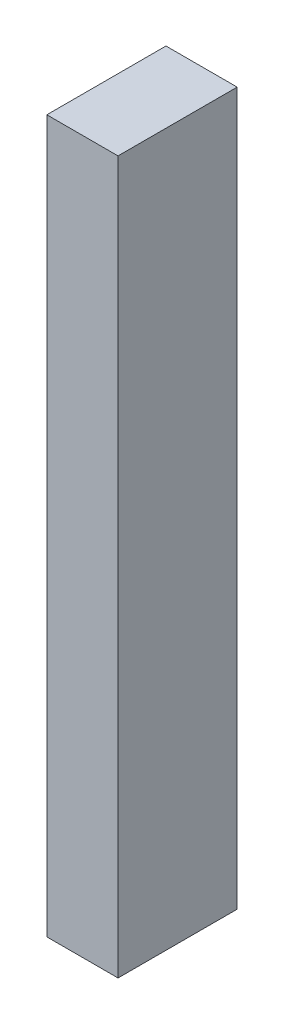
ISO-10303-21;
HEADER;
FILE_DESCRIPTION(('STEP AP214'),'2;1');
FILE_NAME('part.step','',(''),(''),'','','');
FILE_SCHEMA(('AUTOMOTIVE_DESIGN { 1 0 10303 214 1 1 1 1 }'));
ENDSEC;
DATA;
#1=APPLICATION_CONTEXT('core data for automotive mechanical design processes');
#2=APPLICATION_PROTOCOL_DEFINITION('international standard','automotive_design',2000,#1);
#3=PRODUCT_CONTEXT('',#1,'mechanical');
#4=PRODUCT('Part','Part','',(#3));
#5=PRODUCT_RELATED_PRODUCT_CATEGORY('part','',(#4));
#6=PRODUCT_DEFINITION_FORMATION('','',#4);
#7=PRODUCT_DEFINITION_CONTEXT('part definition',#1,'design');
#8=PRODUCT_DEFINITION('design','',#6,#7);
#9=PRODUCT_DEFINITION_SHAPE('','',#8);
#10=(LENGTH_UNIT() NAMED_UNIT(*) SI_UNIT(.MILLI.,.METRE.));
#11=(NAMED_UNIT(*) PLANE_ANGLE_UNIT() SI_UNIT($,.RADIAN.));
#12=(NAMED_UNIT(*) SI_UNIT($,.STERADIAN.) SOLID_ANGLE_UNIT());
#13=UNCERTAINTY_MEASURE_WITH_UNIT(LENGTH_MEASURE(1.E-05),#10,'distance_accuracy_value','');
#14=(GEOMETRIC_REPRESENTATION_CONTEXT(3) GLOBAL_UNCERTAINTY_ASSIGNED_CONTEXT((#13)) GLOBAL_UNIT_ASSIGNED_CONTEXT((#10,
#11,#12)) REPRESENTATION_CONTEXT('',''));
#15=CARTESIAN_POINT('',(0.,0.,0.));
#16=DIRECTION('',(0.,0.,1.));
#17=DIRECTION('',(1.,0.,0.));
#18=AXIS2_PLACEMENT_3D('',#15,#16,#17);
#19=CARTESIAN_POINT('',(2.54,25.4,0.));
#20=DIRECTION('',(1.,0.,0.));
#21=DIRECTION('',(0.,0.,-1.));
#22=AXIS2_PLACEMENT_3D('',#19,#20,#21);
#23=PLANE('',#22);
#24=DIRECTION('',(0.,0.,-1.));
#25=VECTOR('',#24,1.);
#26=CARTESIAN_POINT('',(2.54,-25.4,0.));
#27=LINE('',#26,#25);
#28=CARTESIAN_POINT('',(2.54,-25.4,0.));
#29=VERTEX_POINT('',#28);
#30=CARTESIAN_POINT('',(2.54,-25.4,8.50000078));
#31=VERTEX_POINT('',#30);
#32=EDGE_CURVE('E19',#29,#31,#27,.F.);
#33=ORIENTED_EDGE('',*,*,#32,.F.);
#34=DIRECTION('',(0.,1.,0.));
#35=VECTOR('',#34,1.);
#36=CARTESIAN_POINT('',(2.54,-25.4,0.));
#37=LINE('',#36,#35);
#38=CARTESIAN_POINT('',(2.54,25.4,0.));
#39=VERTEX_POINT('',#38);
#40=EDGE_CURVE('E78',#29,#39,#37,.T.);
#41=ORIENTED_EDGE('',*,*,#40,.T.);
#42=DIRECTION('',(0.,0.,1.));
#43=VECTOR('',#42,1.);
#44=CARTESIAN_POINT('',(2.54,25.4,0.));
#45=LINE('',#44,#43);
#46=CARTESIAN_POINT('',(2.54,25.4,8.50000078));
#47=VERTEX_POINT('',#46);
#48=EDGE_CURVE('E60',#47,#39,#45,.F.);
#49=ORIENTED_EDGE('',*,*,#48,.F.);
#50=DIRECTION('',(0.,1.,0.));
#51=VECTOR('',#50,1.);
#52=CARTESIAN_POINT('',(2.54,-25.4,8.50000078));
#53=LINE('',#52,#51);
#54=EDGE_CURVE('E55',#31,#47,#53,.T.);
#55=ORIENTED_EDGE('',*,*,#54,.F.);
#56=EDGE_LOOP('',(#33,#41,#49,#55));
#57=FACE_BOUND('',#56,.T.);
#58=ADVANCED_FACE('F16',(#57),#23,.T.);
#59=CARTESIAN_POINT('',(2.54,-25.4,0.));
#60=DIRECTION('',(0.,-1.,0.));
#61=DIRECTION('',(0.,0.,-1.));
#62=AXIS2_PLACEMENT_3D('',#59,#60,#61);
#63=PLANE('',#62);
#64=DIRECTION('',(0.,0.,1.));
#65=VECTOR('',#64,1.);
#66=CARTESIAN_POINT('',(-2.54,-25.4,0.));
#67=LINE('',#66,#65);
#68=CARTESIAN_POINT('',(-2.54,-25.4,0.));
#69=VERTEX_POINT('',#68);
#70=CARTESIAN_POINT('',(-2.54,-25.4,8.50000078));
#71=VERTEX_POINT('',#70);
#72=EDGE_CURVE('E82',#69,#71,#67,.T.);
#73=ORIENTED_EDGE('',*,*,#72,.F.);
#74=DIRECTION('',(1.,0.,0.));
#75=VECTOR('',#74,1.);
#76=CARTESIAN_POINT('',(2.54,-25.4,0.));
#77=LINE('',#76,#75);
#78=EDGE_CURVE('E67',#69,#29,#77,.T.);
#79=ORIENTED_EDGE('',*,*,#78,.T.);
#80=ORIENTED_EDGE('',*,*,#32,.T.);
#81=DIRECTION('',(1.,0.,0.));
#82=VECTOR('',#81,1.);
#83=CARTESIAN_POINT('',(2.54,-25.4,8.50000078));
#84=LINE('',#83,#82);
#85=EDGE_CURVE('E62',#71,#31,#84,.T.);
#86=ORIENTED_EDGE('',*,*,#85,.F.);
#87=EDGE_LOOP('',(#73,#79,#80,#86));
#88=FACE_BOUND('',#87,.T.);
#89=ADVANCED_FACE('F64',(#88),#63,.T.);
#90=CARTESIAN_POINT('',(2.54,-25.4,8.50000078));
#91=DIRECTION('',(0.,0.,1.));
#92=DIRECTION('',(1.,0.,0.));
#93=AXIS2_PLACEMENT_3D('',#90,#91,#92);
#94=PLANE('',#93);
#95=DIRECTION('',(0.,1.,0.));
#96=VECTOR('',#95,1.);
#97=CARTESIAN_POINT('',(-2.54,-25.4,8.50000078));
#98=LINE('',#97,#96);
#99=CARTESIAN_POINT('',(-2.54,25.4,8.50000078));
#100=VERTEX_POINT('',#99);
#101=EDGE_CURVE('E71',#71,#100,#98,.T.);
#102=ORIENTED_EDGE('',*,*,#101,.F.);
#103=ORIENTED_EDGE('',*,*,#85,.T.);
#104=ORIENTED_EDGE('',*,*,#54,.T.);
#105=DIRECTION('',(1.,0.,0.));
#106=VECTOR('',#105,1.);
#107=CARTESIAN_POINT('',(-2.54,25.4,8.50000078));
#108=LINE('',#107,#106);
#109=EDGE_CURVE('E73',#100,#47,#108,.T.);
#110=ORIENTED_EDGE('',*,*,#109,.F.);
#111=EDGE_LOOP('',(#102,#103,#104,#110));
#112=FACE_BOUND('',#111,.T.);
#113=ADVANCED_FACE('F69',(#112),#94,.T.);
#114=CARTESIAN_POINT('',(-2.54,25.4,0.));
#115=DIRECTION('',(0.,1.,0.));
#116=DIRECTION('',(0.,0.,1.));
#117=AXIS2_PLACEMENT_3D('',#114,#115,#116);
#118=PLANE('',#117);
#119=ORIENTED_EDGE('',*,*,#48,.T.);
#120=DIRECTION('',(1.,0.,0.));
#121=VECTOR('',#120,1.);
#122=CARTESIAN_POINT('',(2.54,25.4,0.));
#123=LINE('',#122,#121);
#124=CARTESIAN_POINT('',(-2.54,25.4,0.));
#125=VERTEX_POINT('',#124);
#126=EDGE_CURVE('E34',#39,#125,#123,.F.);
#127=ORIENTED_EDGE('',*,*,#126,.T.);
#128=DIRECTION('',(0.,0.,1.));
#129=VECTOR('',#128,1.);
#130=CARTESIAN_POINT('',(-2.54,25.4,0.));
#131=LINE('',#130,#129);
#132=EDGE_CURVE('E25',#100,#125,#131,.F.);
#133=ORIENTED_EDGE('',*,*,#132,.F.);
#134=ORIENTED_EDGE('',*,*,#109,.T.);
#135=EDGE_LOOP('',(#119,#127,#133,#134));
#136=FACE_BOUND('',#135,.T.);
#137=ADVANCED_FACE('F88',(#136),#118,.T.);
#138=CARTESIAN_POINT('',(2.54,-25.4,0.));
#139=DIRECTION('',(0.,0.,1.));
#140=DIRECTION('',(1.,0.,0.));
#141=AXIS2_PLACEMENT_3D('',#138,#139,#140);
#142=PLANE('',#141);
#143=DIRECTION('',(0.,1.,0.));
#144=VECTOR('',#143,1.);
#145=CARTESIAN_POINT('',(-2.54,-25.4,0.));
#146=LINE('',#145,#144);
#147=EDGE_CURVE('E11',#125,#69,#146,.F.);
#148=ORIENTED_EDGE('',*,*,#147,.F.);
#149=ORIENTED_EDGE('',*,*,#126,.F.);
#150=ORIENTED_EDGE('',*,*,#40,.F.);
#151=ORIENTED_EDGE('',*,*,#78,.F.);
#152=EDGE_LOOP('',(#148,#149,#150,#151));
#153=FACE_BOUND('',#152,.T.);
#154=ADVANCED_FACE('F90',(#153),#142,.F.);
#155=CARTESIAN_POINT('',(-2.54,-25.4,0.));
#156=DIRECTION('',(-1.,0.,0.));
#157=DIRECTION('',(0.,0.,1.));
#158=AXIS2_PLACEMENT_3D('',#155,#156,#157);
#159=PLANE('',#158);
#160=ORIENTED_EDGE('',*,*,#132,.T.);
#161=ORIENTED_EDGE('',*,*,#147,.T.);
#162=ORIENTED_EDGE('',*,*,#72,.T.);
#163=ORIENTED_EDGE('',*,*,#101,.T.);
#164=EDGE_LOOP('',(#160,#161,#162,#163));
#165=FACE_BOUND('',#164,.T.);
#166=ADVANCED_FACE('F87',(#165),#159,.T.);
#167=CLOSED_SHELL('',(#58,#89,#113,#137,#154,#166));
#168=MANIFOLD_SOLID_BREP('B1',#167);
#169=ADVANCED_BREP_SHAPE_REPRESENTATION('',(#18,#168),#14);
#170=SHAPE_DEFINITION_REPRESENTATION(#9,#169);
ENDSEC;
END-ISO-10303-21;
